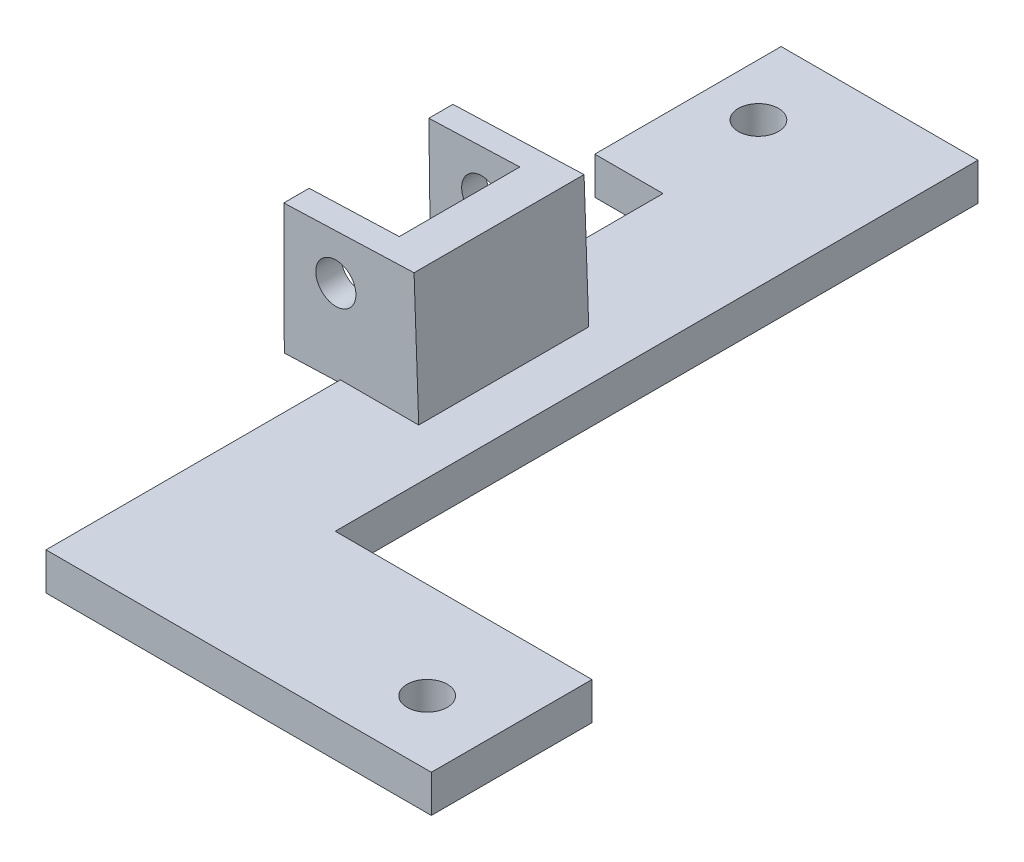
ISO-10303-21;
HEADER;
FILE_DESCRIPTION(('STEP AP214'),'2;1');
FILE_NAME('part.step','',(''),(''),'','','');
FILE_SCHEMA(('AUTOMOTIVE_DESIGN { 1 0 10303 214 1 1 1 1 }'));
ENDSEC;
DATA;
#1=APPLICATION_CONTEXT('core data for automotive mechanical design processes');
#2=APPLICATION_PROTOCOL_DEFINITION('international standard','automotive_design',2000,#1);
#3=PRODUCT_CONTEXT('',#1,'mechanical');
#4=PRODUCT('Part','Part','',(#3));
#5=PRODUCT_RELATED_PRODUCT_CATEGORY('part','',(#4));
#6=PRODUCT_DEFINITION_FORMATION('','',#4);
#7=PRODUCT_DEFINITION_CONTEXT('part definition',#1,'design');
#8=PRODUCT_DEFINITION('design','',#6,#7);
#9=PRODUCT_DEFINITION_SHAPE('','',#8);
#10=(LENGTH_UNIT() NAMED_UNIT(*) SI_UNIT(.MILLI.,.METRE.));
#11=(NAMED_UNIT(*) PLANE_ANGLE_UNIT() SI_UNIT($,.RADIAN.));
#12=(NAMED_UNIT(*) SI_UNIT($,.STERADIAN.) SOLID_ANGLE_UNIT());
#13=UNCERTAINTY_MEASURE_WITH_UNIT(LENGTH_MEASURE(1.E-05),#10,'distance_accuracy_value','');
#14=(GEOMETRIC_REPRESENTATION_CONTEXT(3) GLOBAL_UNCERTAINTY_ASSIGNED_CONTEXT((#13)) GLOBAL_UNIT_ASSIGNED_CONTEXT((#10,
#11,#12)) REPRESENTATION_CONTEXT('',''));
#15=CARTESIAN_POINT('',(0.,0.,0.));
#16=DIRECTION('',(0.,0.,1.));
#17=DIRECTION('',(1.,0.,0.));
#18=AXIS2_PLACEMENT_3D('',#15,#16,#17);
#19=CARTESIAN_POINT('',(346.144684743953,110.000000000002,23.061761583511));
#20=DIRECTION('',(0.,0.,-1.));
#21=DIRECTION('',(1.,0.,0.));
#22=AXIS2_PLACEMENT_3D('',#19,#20,#21);
#23=CYLINDRICAL_SURFACE('',#22,9.525);
#24=DIRECTION('',(0.,0.,-1.));
#25=VECTOR('',#24,1.);
#26=CARTESIAN_POINT('',(352.162161706517,117.383467749306,23.061761583511));
#27=LINE('',#26,#25);
#28=CARTESIAN_POINT('',(352.162161706517,117.383467749306,19.0500000000006));
#29=VERTEX_POINT('',#28);
#30=CARTESIAN_POINT('',(352.162161706517,117.383467749306,0.));
#31=VERTEX_POINT('',#30);
#32=EDGE_CURVE('E334',#29,#31,#27,.T.);
#33=ORIENTED_EDGE('',*,*,#32,.T.);
#34=CARTESIAN_POINT('',(346.144684743953,110.000000000002,0.));
#35=DIRECTION('',(0.,0.,1.));
#36=DIRECTION('',(1.,0.,0.));
#37=AXIS2_PLACEMENT_3D('',#34,#35,#36);
#38=CIRCLE('',#37,9.525);
#39=CARTESIAN_POINT('',(346.486451601042,100.48113344902,0.));
#40=VERTEX_POINT('',#39);
#41=EDGE_CURVE('E302',#40,#31,#38,.T.);
#42=ORIENTED_EDGE('',*,*,#41,.F.);
#43=DIRECTION('',(0.,0.,-1.));
#44=VECTOR('',#43,1.);
#45=CARTESIAN_POINT('',(346.486451601042,100.48113344902,23.061761583511));
#46=LINE('',#45,#44);
#47=CARTESIAN_POINT('',(346.486451601042,100.48113344902,19.0500000000006));
#48=VERTEX_POINT('',#47);
#49=EDGE_CURVE('E325',#48,#40,#46,.T.);
#50=ORIENTED_EDGE('',*,*,#49,.F.);
#51=CARTESIAN_POINT('',(346.144684743953,110.000000000002,19.0500000000006));
#52=DIRECTION('',(0.,0.,1.));
#53=DIRECTION('',(1.,0.,0.));
#54=AXIS2_PLACEMENT_3D('',#51,#52,#53);
#55=CIRCLE('',#54,9.525);
#56=EDGE_CURVE('E303',#48,#29,#55,.T.);
#57=ORIENTED_EDGE('',*,*,#56,.T.);
#58=EDGE_LOOP('',(#33,#42,#50,#57));
#59=FACE_BOUND('',#58,.T.);
#60=ADVANCED_FACE('F43',(#59),#23,.F.);
#61=CARTESIAN_POINT('',(-3.75573745735037,104.604536441931,23.061761583511));
#62=DIRECTION('',(-0.0358810348650173,0.999356068344519,0.));
#63=DIRECTION('',(-0.999356068344519,-0.0358810348650173,0.));
#64=AXIS2_PLACEMENT_3D('',#61,#62,#63);
#65=PLANE('',#64);
#66=ORIENTED_EDGE('',*,*,#32,.F.);
#67=DIRECTION('',(-0.999356068344519,-0.035881034865015,0.));
#68=VECTOR('',#67,1.);
#69=CARTESIAN_POINT('',(-3.75573745735016,104.604536441932,19.0500000000006));
#70=LINE('',#69,#68);
#71=CARTESIAN_POINT('',(337.915550260548,116.871955208187,19.0500000000006));
#72=VERTEX_POINT('',#71);
#73=EDGE_CURVE('E298',#29,#72,#70,.T.);
#74=ORIENTED_EDGE('',*,*,#73,.T.);
#75=DIRECTION('',(0.,0.,1.));
#76=VECTOR('',#75,1.);
#77=CARTESIAN_POINT('',(337.915550260548,116.871955208187,-5.67641578914062));
#78=LINE('',#77,#76);
#79=CARTESIAN_POINT('',(337.915550260548,116.871955208187,23.061761583511));
#80=VERTEX_POINT('',#79);
#81=EDGE_CURVE('E292',#72,#80,#78,.T.);
#82=ORIENTED_EDGE('',*,*,#81,.T.);
#83=DIRECTION('',(-0.999356068344519,-0.0358810348650173,0.));
#84=VECTOR('',#83,1.);
#85=CARTESIAN_POINT('',(-3.75573745735037,104.604536441931,23.061761583511));
#86=LINE('',#85,#84);
#87=CARTESIAN_POINT('',(358.508072740504,117.611312320699,23.061761583511));
#88=VERTEX_POINT('',#87);
#89=EDGE_CURVE('E322',#88,#80,#86,.T.);
#90=ORIENTED_EDGE('',*,*,#89,.F.);
#91=DIRECTION('',(0.,0.,-1.));
#92=VECTOR('',#91,1.);
#93=CARTESIAN_POINT('',(358.508072740504,117.611312320699,23.061761583511));
#94=LINE('',#93,#92);
#95=CARTESIAN_POINT('',(358.508072740506,117.611312320699,-3.81));
#96=VERTEX_POINT('',#95);
#97=EDGE_CURVE('E337',#88,#96,#94,.T.);
#98=ORIENTED_EDGE('',*,*,#97,.T.);
#99=DIRECTION('',(-0.999356068344519,-0.0358810348650153,0.));
#100=VECTOR('',#99,1.);
#101=CARTESIAN_POINT('',(358.508072740506,117.611312320699,-3.81));
#102=LINE('',#101,#100);
#103=CARTESIAN_POINT('',(337.780813741455,116.867117607364,-3.81));
#104=VERTEX_POINT('',#103);
#105=EDGE_CURVE('E271',#96,#104,#102,.T.);
#106=ORIENTED_EDGE('',*,*,#105,.T.);
#107=DIRECTION('',(0.,0.,1.));
#108=VECTOR('',#107,1.);
#109=CARTESIAN_POINT('',(337.780813741455,116.867117607364,-3.81));
#110=LINE('',#109,#108);
#111=CARTESIAN_POINT('',(337.780813741455,116.867117607364,0.));
#112=VERTEX_POINT('',#111);
#113=EDGE_CURVE('E289',#104,#112,#110,.T.);
#114=ORIENTED_EDGE('',*,*,#113,.T.);
#115=DIRECTION('',(-0.999356068344519,-0.0358810348650153,0.));
#116=VECTOR('',#115,1.);
#117=CARTESIAN_POINT('',(358.508072740506,117.611312320699,0.));
#118=LINE('',#117,#116);
#119=EDGE_CURVE('E268',#31,#112,#118,.T.);
#120=ORIENTED_EDGE('',*,*,#119,.F.);
#121=EDGE_LOOP('',(#66,#74,#82,#90,#98,#106,#114,#120));
#122=FACE_BOUND('',#121,.T.);
#123=ADVANCED_FACE('F396',(#122),#65,.T.);
#124=CARTESIAN_POINT('',(362.263810197855,13.0067758787662,23.061761583511));
#125=DIRECTION('',(0.999356068344519,0.0358810348650144,0.));
#126=DIRECTION('',(-0.0358810348650144,0.99935606834452,0.));
#127=AXIS2_PLACEMENT_3D('',#124,#125,#126);
#128=PLANE('',#127);
#129=ORIENTED_EDGE('',*,*,#97,.F.);
#130=DIRECTION('',(-0.0358810348650144,0.999356068344519,0.));
#131=VECTOR('',#130,1.);
#132=CARTESIAN_POINT('',(362.263810197855,13.0067758787662,23.061761583511));
#133=LINE('',#132,#131);
#134=CARTESIAN_POINT('',(359.243555016961,97.1267115029865,23.061761583511));
#135=VERTEX_POINT('',#134);
#136=EDGE_CURVE('E320',#135,#88,#133,.T.);
#137=ORIENTED_EDGE('',*,*,#136,.F.);
#138=DIRECTION('',(0.,0.,-1.));
#139=VECTOR('',#138,1.);
#140=CARTESIAN_POINT('',(359.243555016961,97.1267115029865,23.061761583511));
#141=LINE('',#140,#139);
#142=CARTESIAN_POINT('',(359.243555016962,97.1267115029865,-3.81));
#143=VERTEX_POINT('',#142);
#144=EDGE_CURVE('E340',#135,#143,#141,.T.);
#145=ORIENTED_EDGE('',*,*,#144,.T.);
#146=DIRECTION('',(-0.0358810348650144,0.999356068344519,0.));
#147=VECTOR('',#146,1.);
#148=CARTESIAN_POINT('',(359.243555016962,97.1267115029865,-3.81));
#149=LINE('',#148,#147);
#150=EDGE_CURVE('E280',#143,#96,#149,.T.);
#151=ORIENTED_EDGE('',*,*,#150,.T.);
#152=EDGE_LOOP('',(#129,#137,#145,#151));
#153=FACE_BOUND('',#152,.T.);
#154=ADVANCED_FACE('F428',(#153),#128,.T.);
#155=CARTESIAN_POINT('',(-3.02025518089423,84.1199356242191,23.061761583511));
#156=DIRECTION('',(0.0358810348650174,-0.999356068344519,0.));
#157=DIRECTION('',(0.999356068344519,0.0358810348650174,0.));
#158=AXIS2_PLACEMENT_3D('',#155,#156,#157);
#159=PLANE('',#158);
#160=DIRECTION('',(0.,0.,1.));
#161=VECTOR('',#160,1.);
#162=CARTESIAN_POINT('',(346.864506182946,96.6822522187748,23.0617615835113));
#163=LINE('',#162,#161);
#164=CARTESIAN_POINT('',(346.864506182946,96.6822522187747,-3.81));
#165=VERTEX_POINT('',#164);
#166=CARTESIAN_POINT('',(346.864506182946,96.6822522187748,23.061761583511));
#167=VERTEX_POINT('',#166);
#168=EDGE_CURVE('E259',#165,#167,#163,.T.);
#169=ORIENTED_EDGE('',*,*,#168,.T.);
#170=DIRECTION('',(0.999356068344519,0.0358810348650174,0.));
#171=VECTOR('',#170,1.);
#172=CARTESIAN_POINT('',(-3.02025518089423,84.1199356242191,23.061761583511));
#173=LINE('',#172,#171);
#174=CARTESIAN_POINT('',(338.052257003383,96.3658558610933,23.061761583511));
#175=VERTEX_POINT('',#174);
#176=EDGE_CURVE('E316',#175,#167,#173,.T.);
#177=ORIENTED_EDGE('',*,*,#176,.F.);
#178=DIRECTION('',(0.,0.,-1.));
#179=VECTOR('',#178,1.);
#180=CARTESIAN_POINT('',(338.052257003383,96.3658558610933,23.061761583511));
#181=LINE('',#180,#179);
#182=CARTESIAN_POINT('',(338.052257003384,96.3658558610933,0.));
#183=VERTEX_POINT('',#182);
#184=EDGE_CURVE('E343',#175,#183,#181,.T.);
#185=ORIENTED_EDGE('',*,*,#184,.T.);
#186=DIRECTION('',(0.,0.,1.));
#187=VECTOR('',#186,1.);
#188=CARTESIAN_POINT('',(338.052257003384,96.3658558610933,-3.81));
#189=LINE('',#188,#187);
#190=CARTESIAN_POINT('',(338.052257003384,96.3658558610933,-3.81));
#191=VERTEX_POINT('',#190);
#192=EDGE_CURVE('E282',#191,#183,#189,.T.);
#193=ORIENTED_EDGE('',*,*,#192,.F.);
#194=DIRECTION('',(0.999356068344519,0.0358810348650187,0.));
#195=VECTOR('',#194,1.);
#196=CARTESIAN_POINT('',(338.052257003384,96.3658558610933,-3.81));
#197=LINE('',#196,#195);
#198=EDGE_CURVE('E277',#191,#165,#197,.T.);
#199=ORIENTED_EDGE('',*,*,#198,.T.);
#200=EDGE_LOOP('',(#169,#177,#185,#193,#199));
#201=FACE_BOUND('',#200,.T.);
#202=ADVANCED_FACE('F372',(#201),#159,.T.);
#203=CARTESIAN_POINT('',(341.072512184277,12.245920236874,23.061761583511));
#204=DIRECTION('',(-0.999356068344519,-0.0358810348650171,0.));
#205=DIRECTION('',(0.0358810348650171,-0.999356068344519,0.));
#206=AXIS2_PLACEMENT_3D('',#203,#204,#205);
#207=PLANE('',#206);
#208=DIRECTION('',(0.0358810348650171,-0.999356068344519,0.));
#209=VECTOR('',#208,1.);
#210=CARTESIAN_POINT('',(341.072512184277,12.245920236874,0.));
#211=LINE('',#210,#209);
#212=CARTESIAN_POINT('',(337.915550260547,100.173402481486,0.));
#213=VERTEX_POINT('',#212);
#214=EDGE_CURVE('E317',#213,#183,#211,.T.);
#215=ORIENTED_EDGE('',*,*,#214,.T.);
#216=ORIENTED_EDGE('',*,*,#184,.F.);
#217=DIRECTION('',(0.0358810348650171,-0.999356068344519,0.));
#218=VECTOR('',#217,1.);
#219=CARTESIAN_POINT('',(341.072512184277,12.245920236874,23.061761583511));
#220=LINE('',#219,#218);
#221=CARTESIAN_POINT('',(337.915550260547,100.173402481486,23.061761583511));
#222=VERTEX_POINT('',#221);
#223=EDGE_CURVE('E314',#222,#175,#220,.T.);
#224=ORIENTED_EDGE('',*,*,#223,.F.);
#225=DIRECTION('',(0.,0.,-1.));
#226=VECTOR('',#225,1.);
#227=CARTESIAN_POINT('',(337.915550260547,100.173402481486,23.061761583511));
#228=LINE('',#227,#226);
#229=CARTESIAN_POINT('',(337.915550260547,100.173402481486,19.0500000000006));
#230=VERTEX_POINT('',#229);
#231=EDGE_CURVE('E346',#222,#230,#228,.T.);
#232=ORIENTED_EDGE('',*,*,#231,.T.);
#233=EDGE_CURVE('E349',#230,#213,#228,.T.);
#234=ORIENTED_EDGE('',*,*,#233,.T.);
#235=EDGE_LOOP('',(#215,#216,#224,#232,#234));
#236=FACE_BOUND('',#235,.T.);
#237=ADVANCED_FACE('F363',(#236),#207,.T.);
#238=CARTESIAN_POINT('',(-3.15696192372979,87.9274822446124,23.061761583511));
#239=DIRECTION('',(0.0358810348650153,-0.999356068344519,0.));
#240=DIRECTION('',(0.999356068344519,0.0358810348650153,0.));
#241=AXIS2_PLACEMENT_3D('',#238,#239,#240);
#242=PLANE('',#241);
#243=ORIENTED_EDGE('',*,*,#49,.T.);
#244=DIRECTION('',(0.999356068344519,0.0358810348650153,0.));
#245=VECTOR('',#244,1.);
#246=CARTESIAN_POINT('',(-3.15696192372979,87.9274822446124,0.));
#247=LINE('',#246,#245);
#248=CARTESIAN_POINT('',(338.001802865479,100.176499308355,0.));
#249=VERTEX_POINT('',#248);
#250=EDGE_CURVE('E328',#249,#40,#247,.T.);
#251=ORIENTED_EDGE('',*,*,#250,.F.);
#252=EDGE_CURVE('E329',#213,#249,#247,.T.);
#253=ORIENTED_EDGE('',*,*,#252,.F.);
#254=ORIENTED_EDGE('',*,*,#233,.F.);
#255=DIRECTION('',(0.999356068344519,0.0358810348650153,0.));
#256=VECTOR('',#255,1.);
#257=CARTESIAN_POINT('',(-3.15696192372979,87.9274822446124,19.0500000000006));
#258=LINE('',#257,#256);
#259=EDGE_CURVE('E306',#230,#48,#258,.T.);
#260=ORIENTED_EDGE('',*,*,#259,.T.);
#261=EDGE_LOOP('',(#243,#251,#253,#254,#260));
#262=FACE_BOUND('',#261,.T.);
#263=ADVANCED_FACE('F389',(#262),#242,.F.);
#264=CARTESIAN_POINT('',(0.,0.,23.061761583511));
#265=DIRECTION('',(0.,0.,-1.));
#266=DIRECTION('',(1.,0.,0.));
#267=AXIS2_PLACEMENT_3D('',#264,#265,#266);
#268=PLANE('',#267);
#269=DIRECTION('',(1.,0.,0.));
#270=VECTOR('',#269,1.);
#271=CARTESIAN_POINT('',(0.,97.1267115029864,23.061761583511));
#272=LINE('',#271,#270);
#273=CARTESIAN_POINT('',(346.864506182946,97.1267115029865,23.061761583511));
#274=VERTEX_POINT('',#273);
#275=EDGE_CURVE('E238',#274,#135,#272,.T.);
#276=ORIENTED_EDGE('',*,*,#275,.T.);
#277=ORIENTED_EDGE('',*,*,#136,.T.);
#278=ORIENTED_EDGE('',*,*,#89,.T.);
#279=DIRECTION('',(0.,-1.,0.));
#280=VECTOR('',#279,1.);
#281=CARTESIAN_POINT('',(337.915550260548,0.,23.061761583511));
#282=LINE('',#281,#280);
#283=EDGE_CURVE('E293',#80,#222,#282,.T.);
#284=ORIENTED_EDGE('',*,*,#283,.T.);
#285=ORIENTED_EDGE('',*,*,#223,.T.);
#286=ORIENTED_EDGE('',*,*,#176,.T.);
#287=DIRECTION('',(0.,-1.,0.));
#288=VECTOR('',#287,1.);
#289=CARTESIAN_POINT('',(346.864506182946,0.,23.061761583511));
#290=LINE('',#289,#288);
#291=EDGE_CURVE('E262',#274,#167,#290,.T.);
#292=ORIENTED_EDGE('',*,*,#291,.F.);
#293=EDGE_LOOP('',(#276,#277,#278,#284,#285,#286,#292));
#294=FACE_BOUND('',#293,.T.);
#295=CARTESIAN_POINT('',(346.144684743953,110.000000000002,23.061761583511));
#296=DIRECTION('',(0.,0.,-1.));
#297=DIRECTION('',(-1.,0.,0.));
#298=AXIS2_PLACEMENT_3D('',#295,#296,#297);
#299=CIRCLE('',#298,3.17499999999986);
#300=CARTESIAN_POINT('',(342.969684743953,110.000000000002,23.061761583511));
#301=VERTEX_POINT('',#300);
#302=EDGE_CURVE('E295',#301,#301,#299,.T.);
#303=ORIENTED_EDGE('',*,*,#302,.T.);
#304=EDGE_LOOP('',(#303));
#305=FACE_BOUND('',#304,.T.);
#306=ADVANCED_FACE('F375',(#294,#305),#268,.F.);
#307=CARTESIAN_POINT('',(0.,0.,0.));
#308=DIRECTION('',(0.,0.,-1.));
#309=DIRECTION('',(1.,0.,0.));
#310=AXIS2_PLACEMENT_3D('',#307,#308,#309);
#311=PLANE('',#310);
#312=DIRECTION('',(0.0132391594034909,-0.999912358488627,0.));
#313=VECTOR('',#312,1.);
#314=CARTESIAN_POINT('',(337.780813741455,116.867117607364,0.));
#315=LINE('',#314,#313);
#316=EDGE_CURVE('E286',#249,#183,#315,.T.);
#317=ORIENTED_EDGE('',*,*,#316,.T.);
#318=ORIENTED_EDGE('',*,*,#214,.F.);
#319=ORIENTED_EDGE('',*,*,#252,.T.);
#320=EDGE_LOOP('',(#317,#318,#319));
#321=FACE_BOUND('',#320,.T.);
#322=ADVANCED_FACE('F357',(#321),#311,.T.);
#323=CARTESIAN_POINT('',(337.915550260548,0.,-5.67641578914062));
#324=DIRECTION('',(1.,0.,0.));
#325=DIRECTION('',(0.,0.,1.));
#326=AXIS2_PLACEMENT_3D('',#323,#324,#325);
#327=PLANE('',#326);
#328=DIRECTION('',(0.,-1.,0.));
#329=VECTOR('',#328,1.);
#330=CARTESIAN_POINT('',(337.915550260548,0.,19.0500000000006));
#331=LINE('',#330,#329);
#332=EDGE_CURVE('E308',#72,#230,#331,.T.);
#333=ORIENTED_EDGE('',*,*,#332,.T.);
#334=ORIENTED_EDGE('',*,*,#231,.F.);
#335=ORIENTED_EDGE('',*,*,#283,.F.);
#336=ORIENTED_EDGE('',*,*,#81,.F.);
#337=EDGE_LOOP('',(#333,#334,#335,#336));
#338=FACE_BOUND('',#337,.T.);
#339=ADVANCED_FACE('F380',(#338),#327,.F.);
#340=CARTESIAN_POINT('',(346.144684743953,110.000000000002,-5.67641578914062));
#341=DIRECTION('',(0.,0.,1.));
#342=DIRECTION('',(-1.,0.,0.));
#343=AXIS2_PLACEMENT_3D('',#340,#341,#342);
#344=CYLINDRICAL_SURFACE('',#343,3.17499999999986);
#345=ORIENTED_EDGE('',*,*,#302,.F.);
#346=EDGE_LOOP('',(#345));
#347=FACE_BOUND('',#346,.T.);
#348=CARTESIAN_POINT('',(346.144684743953,110.000000000002,19.0500000000006));
#349=DIRECTION('',(0.,0.,1.));
#350=DIRECTION('',(1.,0.,0.));
#351=AXIS2_PLACEMENT_3D('',#348,#349,#350);
#352=CIRCLE('',#351,3.17499999999986);
#353=CARTESIAN_POINT('',(349.319684743953,110.000000000002,19.0500000000006));
#354=VERTEX_POINT('',#353);
#355=EDGE_CURVE('E299',#354,#354,#352,.F.);
#356=ORIENTED_EDGE('',*,*,#355,.T.);
#357=EDGE_LOOP('',(#356));
#358=FACE_BOUND('',#357,.T.);
#359=ADVANCED_FACE('F455',(#347,#358),#344,.F.);
#360=CARTESIAN_POINT('',(314.158120897483,116.018964789375,19.0500000000006));
#361=DIRECTION('',(0.,0.,-1.));
#362=DIRECTION('',(1.,0.,0.));
#363=AXIS2_PLACEMENT_3D('',#360,#361,#362);
#364=PLANE('',#363);
#365=ORIENTED_EDGE('',*,*,#73,.F.);
#366=ORIENTED_EDGE('',*,*,#56,.F.);
#367=ORIENTED_EDGE('',*,*,#259,.F.);
#368=ORIENTED_EDGE('',*,*,#332,.F.);
#369=EDGE_LOOP('',(#365,#366,#367,#368));
#370=FACE_BOUND('',#369,.T.);
#371=ORIENTED_EDGE('',*,*,#355,.F.);
#372=EDGE_LOOP('',(#371));
#373=FACE_BOUND('',#372,.T.);
#374=ADVANCED_FACE('F385',(#370,#373),#364,.T.);
#375=CARTESIAN_POINT('',(0.,0.,0.));
#376=DIRECTION('',(0.,0.,1.));
#377=DIRECTION('',(-1.,0.,0.));
#378=AXIS2_PLACEMENT_3D('',#375,#376,#377);
#379=PLANE('',#378);
#380=CARTESIAN_POINT('',(346.144684743953,110.000000000002,0.));
#381=DIRECTION('',(0.,0.,1.));
#382=DIRECTION('',(1.,0.,0.));
#383=AXIS2_PLACEMENT_3D('',#380,#381,#382);
#384=CIRCLE('',#383,3.17499999999997);
#385=CARTESIAN_POINT('',(342.969684743953,110.000000000002,0.));
#386=VERTEX_POINT('',#385);
#387=EDGE_CURVE('E264',#386,#386,#384,.T.);
#388=ORIENTED_EDGE('',*,*,#387,.F.);
#389=EDGE_LOOP('',(#388));
#390=FACE_BOUND('',#389,.T.);
#391=ORIENTED_EDGE('',*,*,#41,.T.);
#392=ORIENTED_EDGE('',*,*,#119,.T.);
#393=EDGE_CURVE('E275',#112,#249,#315,.T.);
#394=ORIENTED_EDGE('',*,*,#393,.T.);
#395=ORIENTED_EDGE('',*,*,#250,.T.);
#396=EDGE_LOOP('',(#391,#392,#394,#395));
#397=FACE_BOUND('',#396,.T.);
#398=ADVANCED_FACE('F392',(#390,#397),#379,.T.);
#399=CARTESIAN_POINT('',(0.,0.,-3.81));
#400=DIRECTION('',(0.,0.,1.));
#401=DIRECTION('',(-1.,0.,0.));
#402=AXIS2_PLACEMENT_3D('',#399,#400,#401);
#403=PLANE('',#402);
#404=ORIENTED_EDGE('',*,*,#198,.F.);
#405=DIRECTION('',(0.0132391594034909,-0.999912358488627,0.));
#406=VECTOR('',#405,1.);
#407=CARTESIAN_POINT('',(337.780813741455,116.867117607364,-3.81));
#408=LINE('',#407,#406);
#409=EDGE_CURVE('E274',#104,#191,#408,.T.);
#410=ORIENTED_EDGE('',*,*,#409,.F.);
#411=ORIENTED_EDGE('',*,*,#105,.F.);
#412=ORIENTED_EDGE('',*,*,#150,.F.);
#413=DIRECTION('',(-1.,0.,0.));
#414=VECTOR('',#413,1.);
#415=CARTESIAN_POINT('',(0.,97.1267115029864,-3.81));
#416=LINE('',#415,#414);
#417=CARTESIAN_POINT('',(346.864506182946,97.1267115029865,-3.81));
#418=VERTEX_POINT('',#417);
#419=EDGE_CURVE('E50',#143,#418,#416,.T.);
#420=ORIENTED_EDGE('',*,*,#419,.T.);
#421=DIRECTION('',(0.,1.,0.));
#422=VECTOR('',#421,1.);
#423=CARTESIAN_POINT('',(346.864506182946,0.,-3.81));
#424=LINE('',#423,#422);
#425=EDGE_CURVE('E11',#165,#418,#424,.T.);
#426=ORIENTED_EDGE('',*,*,#425,.F.);
#427=EDGE_LOOP('',(#404,#410,#411,#412,#420,#426));
#428=FACE_BOUND('',#427,.T.);
#429=CARTESIAN_POINT('',(346.144684743953,110.000000000002,-3.81));
#430=DIRECTION('',(0.,0.,1.));
#431=DIRECTION('',(1.,0.,0.));
#432=AXIS2_PLACEMENT_3D('',#429,#430,#431);
#433=CIRCLE('',#432,3.17499999999997);
#434=CARTESIAN_POINT('',(342.969684743953,110.000000000002,-3.81));
#435=VERTEX_POINT('',#434);
#436=EDGE_CURVE('E265',#435,#435,#433,.T.);
#437=ORIENTED_EDGE('',*,*,#436,.T.);
#438=EDGE_LOOP('',(#437));
#439=FACE_BOUND('',#438,.T.);
#440=ADVANCED_FACE('F399',(#428,#439),#403,.F.);
#441=CARTESIAN_POINT('',(337.780813741455,116.867117607364,-3.81));
#442=DIRECTION('',(0.999912358488627,0.0132391594034909,0.));
#443=DIRECTION('',(-0.0132391594034909,0.999912358488627,0.));
#444=AXIS2_PLACEMENT_3D('',#441,#442,#443);
#445=PLANE('',#444);
#446=ORIENTED_EDGE('',*,*,#393,.F.);
#447=ORIENTED_EDGE('',*,*,#113,.F.);
#448=ORIENTED_EDGE('',*,*,#409,.T.);
#449=ORIENTED_EDGE('',*,*,#192,.T.);
#450=ORIENTED_EDGE('',*,*,#316,.F.);
#451=EDGE_LOOP('',(#446,#447,#448,#449,#450));
#452=FACE_BOUND('',#451,.T.);
#453=ADVANCED_FACE('F368',(#452),#445,.F.);
#454=CARTESIAN_POINT('',(346.144684743953,110.000000000002,-3.81));
#455=DIRECTION('',(0.,0.,1.));
#456=DIRECTION('',(-1.,0.,0.));
#457=AXIS2_PLACEMENT_3D('',#454,#455,#456);
#458=CYLINDRICAL_SURFACE('',#457,3.17499999999997);
#459=CARTESIAN_POINT('',(342.969684743953,110.000000000002,-3.81));
#460=CARTESIAN_POINT('',(342.969684743953,110.000000000002,-3.7703125));
#461=CARTESIAN_POINT('',(342.969684743953,110.000000000002,-3.730625));
#462=CARTESIAN_POINT('',(342.969684743953,110.000000000002,-3.65125));
#463=CARTESIAN_POINT('',(342.969684743953,110.000000000002,-3.6115625));
#464=CARTESIAN_POINT('',(342.969684743953,110.000000000002,-3.5321875));
#465=CARTESIAN_POINT('',(342.969684743953,110.000000000002,-3.4925));
#466=CARTESIAN_POINT('',(342.969684743953,110.000000000002,-3.413125));
#467=CARTESIAN_POINT('',(342.969684743953,110.000000000002,-3.3734375));
#468=CARTESIAN_POINT('',(342.969684743953,110.000000000002,-3.2940625));
#469=CARTESIAN_POINT('',(342.969684743953,110.000000000002,-3.254375));
#470=CARTESIAN_POINT('',(342.969684743953,110.000000000002,-3.175));
#471=CARTESIAN_POINT('',(342.969684743953,110.000000000002,-3.1353125));
#472=CARTESIAN_POINT('',(342.969684743953,110.000000000002,-3.0559375));
#473=CARTESIAN_POINT('',(342.969684743953,110.000000000002,-3.01625));
#474=CARTESIAN_POINT('',(342.969684743953,110.000000000002,-2.936875));
#475=CARTESIAN_POINT('',(342.969684743953,110.000000000002,-2.8971875));
#476=CARTESIAN_POINT('',(342.969684743953,110.000000000002,-2.8178125));
#477=CARTESIAN_POINT('',(342.969684743953,110.000000000002,-2.778125));
#478=CARTESIAN_POINT('',(342.969684743953,110.000000000002,-2.69875));
#479=CARTESIAN_POINT('',(342.969684743953,110.000000000002,-2.6590625));
#480=CARTESIAN_POINT('',(342.969684743953,110.000000000002,-2.5796875));
#481=CARTESIAN_POINT('',(342.969684743953,110.000000000002,-2.54));
#482=CARTESIAN_POINT('',(342.969684743953,110.000000000002,-2.460625));
#483=CARTESIAN_POINT('',(342.969684743953,110.000000000002,-2.4209375));
#484=CARTESIAN_POINT('',(342.969684743953,110.000000000002,-2.3415625));
#485=CARTESIAN_POINT('',(342.969684743953,110.000000000002,-2.301875));
#486=CARTESIAN_POINT('',(342.969684743953,110.000000000002,-2.2225));
#487=CARTESIAN_POINT('',(342.969684743953,110.000000000002,-2.1828125));
#488=CARTESIAN_POINT('',(342.969684743953,110.000000000002,-2.1034375));
#489=CARTESIAN_POINT('',(342.969684743953,110.000000000002,-2.06375));
#490=CARTESIAN_POINT('',(342.969684743953,110.000000000002,-1.984375));
#491=CARTESIAN_POINT('',(342.969684743953,110.000000000002,-1.9446875));
#492=CARTESIAN_POINT('',(342.969684743953,110.000000000002,-1.8653125));
#493=CARTESIAN_POINT('',(342.969684743953,110.000000000002,-1.825625));
#494=CARTESIAN_POINT('',(342.969684743953,110.000000000002,-1.74625));
#495=CARTESIAN_POINT('',(342.969684743953,110.000000000002,-1.7065625));
#496=CARTESIAN_POINT('',(342.969684743953,110.000000000002,-1.6271875));
#497=CARTESIAN_POINT('',(342.969684743953,110.000000000002,-1.5875));
#498=CARTESIAN_POINT('',(342.969684743953,110.000000000002,-1.508125));
#499=CARTESIAN_POINT('',(342.969684743953,110.000000000002,-1.4684375));
#500=CARTESIAN_POINT('',(342.969684743953,110.000000000002,-1.3890625));
#501=CARTESIAN_POINT('',(342.969684743953,110.000000000002,-1.349375));
#502=CARTESIAN_POINT('',(342.969684743953,110.000000000002,-1.27));
#503=CARTESIAN_POINT('',(342.969684743953,110.000000000002,-1.2303125));
#504=CARTESIAN_POINT('',(342.969684743953,110.000000000002,-1.1509375));
#505=CARTESIAN_POINT('',(342.969684743953,110.000000000002,-1.11125));
#506=CARTESIAN_POINT('',(342.969684743953,110.000000000002,-1.031875));
#507=CARTESIAN_POINT('',(342.969684743953,110.000000000002,-0.9921875));
#508=CARTESIAN_POINT('',(342.969684743953,110.000000000002,-0.9128125));
#509=CARTESIAN_POINT('',(342.969684743953,110.000000000002,-0.873125));
#510=CARTESIAN_POINT('',(342.969684743953,110.000000000002,-0.79375));
#511=CARTESIAN_POINT('',(342.969684743953,110.000000000002,-0.7540625));
#512=CARTESIAN_POINT('',(342.969684743953,110.000000000002,-0.6746875));
#513=CARTESIAN_POINT('',(342.969684743953,110.000000000002,-0.635));
#514=CARTESIAN_POINT('',(342.969684743953,110.000000000002,-0.555625));
#515=CARTESIAN_POINT('',(342.969684743953,110.000000000002,-0.5159375));
#516=CARTESIAN_POINT('',(342.969684743953,110.000000000002,-0.4365625));
#517=CARTESIAN_POINT('',(342.969684743953,110.000000000002,-0.396875));
#518=CARTESIAN_POINT('',(342.969684743953,110.000000000002,-0.3175));
#519=CARTESIAN_POINT('',(342.969684743953,110.000000000002,-0.2778125));
#520=CARTESIAN_POINT('',(342.969684743953,110.000000000002,-0.1984375));
#521=CARTESIAN_POINT('',(342.969684743953,110.000000000002,-0.15875));
#522=CARTESIAN_POINT('',(342.969684743953,110.000000000002,-0.0793749999999999));
#523=CARTESIAN_POINT('',(342.969684743953,110.000000000002,-0.0396874999999999));
#524=CARTESIAN_POINT('',(342.969684743953,110.000000000002,0.));
#525=B_SPLINE_CURVE_WITH_KNOTS('',3,(#459,#460,#461,#462,#463,#464,#465,#466,#467,#468,#469,
#470,#471,#472,#473,#474,#475,#476,#477,#478,#479,#480,#481,#482,#483,#484,#485,#486,#487,#488,
#489,#490,#491,#492,#493,#494,#495,#496,#497,#498,#499,#500,#501,#502,#503,#504,#505,#506,#507,
#508,#509,#510,#511,#512,#513,#514,#515,#516,#517,#518,#519,#520,#521,#522,#523,#524),
.UNSPECIFIED.,.F.,.F.,(4,2,2,2,2,2,2,2,2,2,2,2,2,2,2,2,2,2,2,2,2,2,2,2,2,2,2,2,2,2,2,2,4),(0.,
0.1190625,0.238125,0.3571875,0.47625,0.5953125,0.714375,0.833437499999999,0.9525,1.0715625,
1.190625,1.3096875,1.42875,1.5478125,1.666875,1.7859375,1.905,2.0240625,2.143125,2.2621875,
2.38125,2.5003125,2.619375,2.7384375,2.8575,2.9765625,3.095625,3.2146875,3.33375,3.4528125,
3.571875,3.6909375,3.81),.UNSPECIFIED.);
#526=EDGE_CURVE('BSEAM463',#435,#386,#525,.T.);
#527=ORIENTED_EDGE('',*,*,#436,.F.);
#528=ORIENTED_EDGE('',*,*,#387,.T.);
#529=ORIENTED_EDGE('',*,*,#526,.T.);
#530=ORIENTED_EDGE('',*,*,#526,.F.);
#531=EDGE_LOOP('',(#527,#529,#528,#530));
#532=FACE_BOUND('',#531,.T.);
#533=ADVANCED_FACE('F463',(#532),#458,.F.);
#534=CARTESIAN_POINT('',(346.864506182946,-54.3463356240454,44.9579999999997));
#535=DIRECTION('',(-1.,0.,0.));
#536=DIRECTION('',(0.,0.,-1.));
#537=AXIS2_PLACEMENT_3D('',#534,#535,#536);
#538=PLANE('',#537);
#539=ORIENTED_EDGE('',*,*,#291,.T.);
#540=ORIENTED_EDGE('',*,*,#168,.F.);
#541=ORIENTED_EDGE('',*,*,#425,.T.);
#542=DIRECTION('',(0.,0.,-1.));
#543=VECTOR('',#542,1.);
#544=CARTESIAN_POINT('',(346.864506182946,97.1267115029864,44.958));
#545=LINE('',#544,#543);
#546=CARTESIAN_POINT('',(346.864506182946,97.1267115029866,-27.94));
#547=VERTEX_POINT('',#546);
#548=EDGE_CURVE('E213',#418,#547,#545,.T.);
#549=ORIENTED_EDGE('',*,*,#548,.T.);
#550=DIRECTION('',(0.,1.,0.));
#551=VECTOR('',#550,1.);
#552=CARTESIAN_POINT('',(346.864506182946,-54.3463356240452,-27.9400000000003));
#553=LINE('',#552,#551);
#554=CARTESIAN_POINT('',(346.864506182946,91.2114000000018,-27.94));
#555=VERTEX_POINT('',#554);
#556=EDGE_CURVE('E232',#555,#547,#553,.T.);
#557=ORIENTED_EDGE('',*,*,#556,.F.);
#558=DIRECTION('',(0.,0.,-1.));
#559=VECTOR('',#558,1.);
#560=CARTESIAN_POINT('',(346.864506182946,91.2114000000017,44.958));
#561=LINE('',#560,#559);
#562=CARTESIAN_POINT('',(346.864506182946,91.2114000000017,69.596));
#563=VERTEX_POINT('',#562);
#564=EDGE_CURVE('E241',#563,#555,#561,.T.);
#565=ORIENTED_EDGE('',*,*,#564,.F.);
#566=DIRECTION('',(0.,1.,0.));
#567=VECTOR('',#566,1.);
#568=CARTESIAN_POINT('',(346.864506182946,-54.3463356240455,69.5959999999997));
#569=LINE('',#568,#567);
#570=CARTESIAN_POINT('',(346.864506182946,97.1267115029864,69.596));
#571=VERTEX_POINT('',#570);
#572=EDGE_CURVE('E190',#563,#571,#569,.T.);
#573=ORIENTED_EDGE('',*,*,#572,.T.);
#574=EDGE_CURVE('E65',#571,#274,#545,.T.);
#575=ORIENTED_EDGE('',*,*,#574,.T.);
#576=EDGE_LOOP('',(#539,#540,#541,#549,#557,#565,#573,#575));
#577=FACE_BOUND('',#576,.T.);
#578=ADVANCED_FACE('F401',(#577),#538,.T.);
#579=CARTESIAN_POINT('',(0.,97.1267115029864,2.18833329443828E-13));
#580=DIRECTION('',(0.,-1.,0.));
#581=DIRECTION('',(0.,0.,1.));
#582=AXIS2_PLACEMENT_3D('',#579,#580,#581);
#583=PLANE('',#582);
#584=CARTESIAN_POINT('',(344.324506182946,97.1267115029866,-45.5527908784176));
#585=DIRECTION('',(0.,-1.,0.));
#586=DIRECTION('',(0.,0.,-1.));
#587=AXIS2_PLACEMENT_3D('',#584,#585,#586);
#588=CIRCLE('',#587,3.17499999999997);
#589=CARTESIAN_POINT('',(344.324506182946,97.1267115029866,-48.7277908784176));
#590=VERTEX_POINT('',#589);
#591=EDGE_CURVE('E214',#590,#590,#588,.T.);
#592=ORIENTED_EDGE('',*,*,#591,.T.);
#593=EDGE_LOOP('',(#592));
#594=FACE_BOUND('',#593,.T.);
#595=CARTESIAN_POINT('',(396.977487406266,97.1267115029864,59.4567827712861));
#596=DIRECTION('',(0.,-1.,0.));
#597=DIRECTION('',(0.,0.,-1.));
#598=AXIS2_PLACEMENT_3D('',#595,#596,#597);
#599=CIRCLE('',#598,3.17499999999997);
#600=CARTESIAN_POINT('',(396.977487406266,97.1267115029864,56.2817827712861));
#601=VERTEX_POINT('',#600);
#602=EDGE_CURVE('E229',#601,#601,#599,.T.);
#603=ORIENTED_EDGE('',*,*,#602,.T.);
#604=EDGE_LOOP('',(#603));
#605=FACE_BOUND('',#604,.T.);
#606=DIRECTION('',(1.,0.,0.));
#607=VECTOR('',#606,1.);
#608=CARTESIAN_POINT('',(407.824506182946,97.1267115029864,44.196));
#609=LINE('',#608,#607);
#610=CARTESIAN_POINT('',(367.184506182946,97.1267115029864,44.196));
#611=VERTEX_POINT('',#610);
#612=CARTESIAN_POINT('',(407.772486982946,97.1267115029864,44.196));
#613=VERTEX_POINT('',#612);
#614=EDGE_CURVE('E215',#611,#613,#609,.T.);
#615=ORIENTED_EDGE('',*,*,#614,.F.);
#616=DIRECTION('',(0.,0.,1.));
#617=VECTOR('',#616,1.);
#618=CARTESIAN_POINT('',(367.184506182946,97.1267115029864,44.196));
#619=LINE('',#618,#617);
#620=CARTESIAN_POINT('',(367.184506182946,97.1267115029866,-57.404));
#621=VERTEX_POINT('',#620);
#622=EDGE_CURVE('E219',#621,#611,#619,.T.);
#623=ORIENTED_EDGE('',*,*,#622,.F.);
#624=DIRECTION('',(1.,0.,0.));
#625=VECTOR('',#624,1.);
#626=CARTESIAN_POINT('',(367.184506182946,97.1267115029866,-57.404));
#627=LINE('',#626,#625);
#628=CARTESIAN_POINT('',(336.069506182946,97.1267115029866,-57.404));
#629=VERTEX_POINT('',#628);
#630=EDGE_CURVE('E222',#629,#621,#627,.T.);
#631=ORIENTED_EDGE('',*,*,#630,.F.);
#632=DIRECTION('',(0.,0.,1.));
#633=VECTOR('',#632,1.);
#634=CARTESIAN_POINT('',(336.069506182946,97.1267115029866,-57.404));
#635=LINE('',#634,#633);
#636=CARTESIAN_POINT('',(336.069506182946,97.1267115029866,-27.94));
#637=VERTEX_POINT('',#636);
#638=EDGE_CURVE('E204',#629,#637,#635,.T.);
#639=ORIENTED_EDGE('',*,*,#638,.T.);
#640=DIRECTION('',(-1.,0.,0.));
#641=VECTOR('',#640,1.);
#642=CARTESIAN_POINT('',(336.704506182946,97.1267115029866,-27.94));
#643=LINE('',#642,#641);
#644=EDGE_CURVE('E225',#547,#637,#643,.T.);
#645=ORIENTED_EDGE('',*,*,#644,.F.);
#646=ORIENTED_EDGE('',*,*,#548,.F.);
#647=ORIENTED_EDGE('',*,*,#419,.F.);
#648=ORIENTED_EDGE('',*,*,#144,.F.);
#649=ORIENTED_EDGE('',*,*,#275,.F.);
#650=ORIENTED_EDGE('',*,*,#574,.F.);
#651=DIRECTION('',(-1.,0.,0.));
#652=VECTOR('',#651,1.);
#653=CARTESIAN_POINT('',(346.864506182946,97.1267115029864,69.596));
#654=LINE('',#653,#652);
#655=CARTESIAN_POINT('',(407.772486982946,97.1267115029864,69.596));
#656=VERTEX_POINT('',#655);
#657=EDGE_CURVE('E211',#656,#571,#654,.T.);
#658=ORIENTED_EDGE('',*,*,#657,.F.);
#659=DIRECTION('',(0.,0.,-1.));
#660=VECTOR('',#659,1.);
#661=CARTESIAN_POINT('',(407.772486982946,97.1267115029864,44.196));
#662=LINE('',#661,#660);
#663=EDGE_CURVE('E196',#656,#613,#662,.T.);
#664=ORIENTED_EDGE('',*,*,#663,.T.);
#665=EDGE_LOOP('',(#615,#623,#631,#639,#645,#646,#647,#648,#649,#650,#658,#664));
#666=FACE_BOUND('',#665,.T.);
#667=ADVANCED_FACE('F406',(#594,#605,#666),#583,.F.);
#668=CARTESIAN_POINT('',(346.864506182946,-54.3463356240455,69.5959999999997));
#669=DIRECTION('',(0.,0.,1.));
#670=DIRECTION('',(0.,1.,0.));
#671=AXIS2_PLACEMENT_3D('',#668,#669,#670);
#672=PLANE('',#671);
#673=DIRECTION('',(0.,1.,0.));
#674=VECTOR('',#673,1.);
#675=CARTESIAN_POINT('',(407.772486982946,91.2114000000018,69.596));
#676=LINE('',#675,#674);
#677=CARTESIAN_POINT('',(407.772486982946,91.2114000000018,69.596));
#678=VERTEX_POINT('',#677);
#679=EDGE_CURVE('E184',#678,#656,#676,.T.);
#680=ORIENTED_EDGE('',*,*,#679,.T.);
#681=ORIENTED_EDGE('',*,*,#657,.T.);
#682=ORIENTED_EDGE('',*,*,#572,.F.);
#683=DIRECTION('',(-1.,0.,0.));
#684=VECTOR('',#683,1.);
#685=CARTESIAN_POINT('',(346.864506182946,91.2114000000017,69.596));
#686=LINE('',#685,#684);
#687=EDGE_CURVE('E179',#678,#563,#686,.T.);
#688=ORIENTED_EDGE('',*,*,#687,.F.);
#689=EDGE_LOOP('',(#680,#681,#682,#688));
#690=FACE_BOUND('',#689,.T.);
#691=ADVANCED_FACE('F188',(#690),#672,.T.);
#692=CARTESIAN_POINT('',(407.824506182946,-54.3463356240454,44.1959999999997));
#693=DIRECTION('',(0.,0.,-1.));
#694=DIRECTION('',(0.,-1.,0.));
#695=AXIS2_PLACEMENT_3D('',#692,#693,#694);
#696=PLANE('',#695);
#697=DIRECTION('',(0.,-1.,0.));
#698=VECTOR('',#697,1.);
#699=CARTESIAN_POINT('',(407.772486982946,91.2114000000018,44.196));
#700=LINE('',#699,#698);
#701=CARTESIAN_POINT('',(407.772486982946,91.2114000000018,44.196));
#702=VERTEX_POINT('',#701);
#703=EDGE_CURVE('E185',#613,#702,#700,.T.);
#704=ORIENTED_EDGE('',*,*,#703,.T.);
#705=DIRECTION('',(1.,0.,0.));
#706=VECTOR('',#705,1.);
#707=CARTESIAN_POINT('',(407.824506182946,91.2114000000018,44.196));
#708=LINE('',#707,#706);
#709=CARTESIAN_POINT('',(367.184506182946,91.2114000000018,44.196));
#710=VERTEX_POINT('',#709);
#711=EDGE_CURVE('E182',#710,#702,#708,.T.);
#712=ORIENTED_EDGE('',*,*,#711,.F.);
#713=DIRECTION('',(0.,1.,0.));
#714=VECTOR('',#713,1.);
#715=CARTESIAN_POINT('',(367.184506182946,-54.3463356240454,44.1959999999997));
#716=LINE('',#715,#714);
#717=EDGE_CURVE('E247',#710,#611,#716,.T.);
#718=ORIENTED_EDGE('',*,*,#717,.T.);
#719=ORIENTED_EDGE('',*,*,#614,.T.);
#720=EDGE_LOOP('',(#704,#712,#718,#719));
#721=FACE_BOUND('',#720,.T.);
#722=ADVANCED_FACE('F425',(#721),#696,.T.);
#723=CARTESIAN_POINT('',(367.184506182946,-54.3463356240454,44.1959999999997));
#724=DIRECTION('',(1.,0.,0.));
#725=DIRECTION('',(0.,1.,0.));
#726=AXIS2_PLACEMENT_3D('',#723,#724,#725);
#727=PLANE('',#726);
#728=DIRECTION('',(0.,1.,0.));
#729=VECTOR('',#728,1.);
#730=CARTESIAN_POINT('',(367.184506182946,-54.3463356240452,-57.4040000000003));
#731=LINE('',#730,#729);
#732=CARTESIAN_POINT('',(367.184506182946,91.211400000002,-57.404));
#733=VERTEX_POINT('',#732);
#734=EDGE_CURVE('E250',#733,#621,#731,.T.);
#735=ORIENTED_EDGE('',*,*,#734,.T.);
#736=ORIENTED_EDGE('',*,*,#622,.T.);
#737=ORIENTED_EDGE('',*,*,#717,.F.);
#738=DIRECTION('',(0.,0.,1.));
#739=VECTOR('',#738,1.);
#740=CARTESIAN_POINT('',(367.184506182946,91.2114000000018,44.196));
#741=LINE('',#740,#739);
#742=EDGE_CURVE('E245',#733,#710,#741,.T.);
#743=ORIENTED_EDGE('',*,*,#742,.F.);
#744=EDGE_LOOP('',(#735,#736,#737,#743));
#745=FACE_BOUND('',#744,.T.);
#746=ADVANCED_FACE('F422',(#745),#727,.T.);
#747=CARTESIAN_POINT('',(367.184506182946,-54.3463356240452,-57.4040000000003));
#748=DIRECTION('',(0.,0.,-1.));
#749=DIRECTION('',(0.,-1.,0.));
#750=AXIS2_PLACEMENT_3D('',#747,#748,#749);
#751=PLANE('',#750);
#752=ORIENTED_EDGE('',*,*,#630,.T.);
#753=ORIENTED_EDGE('',*,*,#734,.F.);
#754=DIRECTION('',(1.,0.,0.));
#755=VECTOR('',#754,1.);
#756=CARTESIAN_POINT('',(367.184506182946,91.211400000002,-57.404));
#757=LINE('',#756,#755);
#758=CARTESIAN_POINT('',(336.069506182946,91.211400000002,-57.4040000000003));
#759=VERTEX_POINT('',#758);
#760=EDGE_CURVE('E248',#759,#733,#757,.T.);
#761=ORIENTED_EDGE('',*,*,#760,.F.);
#762=DIRECTION('',(0.,1.,0.));
#763=VECTOR('',#762,1.);
#764=CARTESIAN_POINT('',(336.069506182946,91.211400000002,-57.4040000000003));
#765=LINE('',#764,#763);
#766=EDGE_CURVE('E199',#759,#629,#765,.T.);
#767=ORIENTED_EDGE('',*,*,#766,.T.);
#768=EDGE_LOOP('',(#752,#753,#761,#767));
#769=FACE_BOUND('',#768,.T.);
#770=ADVANCED_FACE('F419',(#769),#751,.T.);
#771=CARTESIAN_POINT('',(336.704506182946,-54.3463356240452,-27.9400000000003));
#772=DIRECTION('',(0.,0.,1.));
#773=DIRECTION('',(0.,1.,0.));
#774=AXIS2_PLACEMENT_3D('',#771,#772,#773);
#775=PLANE('',#774);
#776=ORIENTED_EDGE('',*,*,#556,.T.);
#777=ORIENTED_EDGE('',*,*,#644,.T.);
#778=DIRECTION('',(0.,-1.,0.));
#779=VECTOR('',#778,1.);
#780=CARTESIAN_POINT('',(336.069506182946,91.211400000002,-27.94));
#781=LINE('',#780,#779);
#782=CARTESIAN_POINT('',(336.069506182946,91.211400000002,-27.94));
#783=VERTEX_POINT('',#782);
#784=EDGE_CURVE('E207',#637,#783,#781,.T.);
#785=ORIENTED_EDGE('',*,*,#784,.T.);
#786=DIRECTION('',(-1.,0.,0.));
#787=VECTOR('',#786,1.);
#788=CARTESIAN_POINT('',(336.704506182946,91.2114000000019,-27.94));
#789=LINE('',#788,#787);
#790=EDGE_CURVE('E242',#555,#783,#789,.T.);
#791=ORIENTED_EDGE('',*,*,#790,.F.);
#792=EDGE_LOOP('',(#776,#777,#785,#791));
#793=FACE_BOUND('',#792,.T.);
#794=ADVANCED_FACE('F411',(#793),#775,.T.);
#795=CARTESIAN_POINT('',(396.977487406266,-54.3463356240454,59.4567827712857));
#796=DIRECTION('',(0.,1.,0.));
#797=DIRECTION('',(0.,0.,-1.));
#798=AXIS2_PLACEMENT_3D('',#795,#796,#797);
#799=CYLINDRICAL_SURFACE('',#798,3.17499999999997);
#800=ORIENTED_EDGE('',*,*,#602,.F.);
#801=EDGE_LOOP('',(#800));
#802=FACE_BOUND('',#801,.T.);
#803=CARTESIAN_POINT('',(396.977487406266,91.2114000000017,59.4567827712861));
#804=DIRECTION('',(0.,1.,0.));
#805=DIRECTION('',(0.,0.,1.));
#806=AXIS2_PLACEMENT_3D('',#803,#804,#805);
#807=CIRCLE('',#806,3.17499999999997);
#808=CARTESIAN_POINT('',(396.977487406266,91.2114000000017,62.631782771286));
#809=VERTEX_POINT('',#808);
#810=EDGE_CURVE('E235',#809,#809,#807,.F.);
#811=ORIENTED_EDGE('',*,*,#810,.T.);
#812=EDGE_LOOP('',(#811));
#813=FACE_BOUND('',#812,.T.);
#814=ADVANCED_FACE('F477',(#802,#813),#799,.F.);
#815=CARTESIAN_POINT('',(344.324506182946,-54.3463356240452,-45.5527908784179));
#816=DIRECTION('',(0.,1.,0.));
#817=DIRECTION('',(0.,0.,-1.));
#818=AXIS2_PLACEMENT_3D('',#815,#816,#817);
#819=CYLINDRICAL_SURFACE('',#818,3.17499999999997);
#820=ORIENTED_EDGE('',*,*,#591,.F.);
#821=EDGE_LOOP('',(#820));
#822=FACE_BOUND('',#821,.T.);
#823=CARTESIAN_POINT('',(344.324506182946,91.211400000002,-45.5527908784176));
#824=DIRECTION('',(0.,1.,0.));
#825=DIRECTION('',(0.,0.,1.));
#826=AXIS2_PLACEMENT_3D('',#823,#824,#825);
#827=CIRCLE('',#826,3.17499999999997);
#828=CARTESIAN_POINT('',(344.324506182946,91.211400000002,-42.3777908784176));
#829=VERTEX_POINT('',#828);
#830=EDGE_CURVE('E218',#829,#829,#827,.F.);
#831=ORIENTED_EDGE('',*,*,#830,.T.);
#832=EDGE_LOOP('',(#831));
#833=FACE_BOUND('',#832,.T.);
#834=ADVANCED_FACE('F474',(#822,#833),#819,.F.);
#835=CARTESIAN_POINT('',(344.324506182946,91.211400000002,-45.5527908784163));
#836=DIRECTION('',(0.,-1.,0.));
#837=DIRECTION('',(0.494826018082043,0.,0.868992066608821));
#838=AXIS2_PLACEMENT_3D('',#835,#836,#837);
#839=PLANE('',#838);
#840=DIRECTION('',(0.,0.,1.));
#841=VECTOR('',#840,1.);
#842=CARTESIAN_POINT('',(407.772486982946,91.2114000000018,44.196));
#843=LINE('',#842,#841);
#844=EDGE_CURVE('E57',#702,#678,#843,.T.);
#845=ORIENTED_EDGE('',*,*,#844,.T.);
#846=ORIENTED_EDGE('',*,*,#687,.T.);
#847=ORIENTED_EDGE('',*,*,#564,.T.);
#848=ORIENTED_EDGE('',*,*,#790,.T.);
#849=DIRECTION('',(0.,0.,-1.));
#850=VECTOR('',#849,1.);
#851=CARTESIAN_POINT('',(336.069506182946,91.211400000002,-57.4040000000003));
#852=LINE('',#851,#850);
#853=EDGE_CURVE('E192',#783,#759,#852,.T.);
#854=ORIENTED_EDGE('',*,*,#853,.T.);
#855=ORIENTED_EDGE('',*,*,#760,.T.);
#856=ORIENTED_EDGE('',*,*,#742,.T.);
#857=ORIENTED_EDGE('',*,*,#711,.T.);
#858=EDGE_LOOP('',(#845,#846,#847,#848,#854,#855,#856,#857));
#859=FACE_BOUND('',#858,.T.);
#860=ORIENTED_EDGE('',*,*,#830,.F.);
#861=EDGE_LOOP('',(#860));
#862=FACE_BOUND('',#861,.T.);
#863=ORIENTED_EDGE('',*,*,#810,.F.);
#864=EDGE_LOOP('',(#863));
#865=FACE_BOUND('',#864,.T.);
#866=ADVANCED_FACE('F176',(#859,#862,#865),#839,.T.);
#867=CARTESIAN_POINT('',(336.069506182946,0.,0.));
#868=DIRECTION('',(-1.,0.,0.));
#869=DIRECTION('',(0.,0.,-1.));
#870=AXIS2_PLACEMENT_3D('',#867,#868,#869);
#871=PLANE('',#870);
#872=ORIENTED_EDGE('',*,*,#766,.F.);
#873=ORIENTED_EDGE('',*,*,#853,.F.);
#874=ORIENTED_EDGE('',*,*,#784,.F.);
#875=ORIENTED_EDGE('',*,*,#638,.F.);
#876=EDGE_LOOP('',(#872,#873,#874,#875));
#877=FACE_BOUND('',#876,.T.);
#878=ADVANCED_FACE('F416',(#877),#871,.T.);
#879=CARTESIAN_POINT('',(407.772486982946,0.,0.));
#880=DIRECTION('',(-1.,0.,0.));
#881=DIRECTION('',(0.,0.,-1.));
#882=AXIS2_PLACEMENT_3D('',#879,#880,#881);
#883=PLANE('',#882);
#884=ORIENTED_EDGE('',*,*,#703,.F.);
#885=ORIENTED_EDGE('',*,*,#663,.F.);
#886=ORIENTED_EDGE('',*,*,#679,.F.);
#887=ORIENTED_EDGE('',*,*,#844,.F.);
#888=EDGE_LOOP('',(#884,#885,#886,#887));
#889=FACE_BOUND('',#888,.T.);
#890=ADVANCED_FACE('F194',(#889),#883,.F.);
#891=CLOSED_SHELL('',(#60,#123,#154,#202,#237,#263,#306,#322,#339,#359,#374,#398,#440,#453,#533,
#578,#667,#691,#722,#746,#770,#794,#814,#834,#866,#878,#890));
#892=MANIFOLD_SOLID_BREP('B2',#891);
#893=ADVANCED_BREP_SHAPE_REPRESENTATION('',(#18,#892),#14);
#894=SHAPE_DEFINITION_REPRESENTATION(#9,#893);
ENDSEC;
END-ISO-10303-21;
